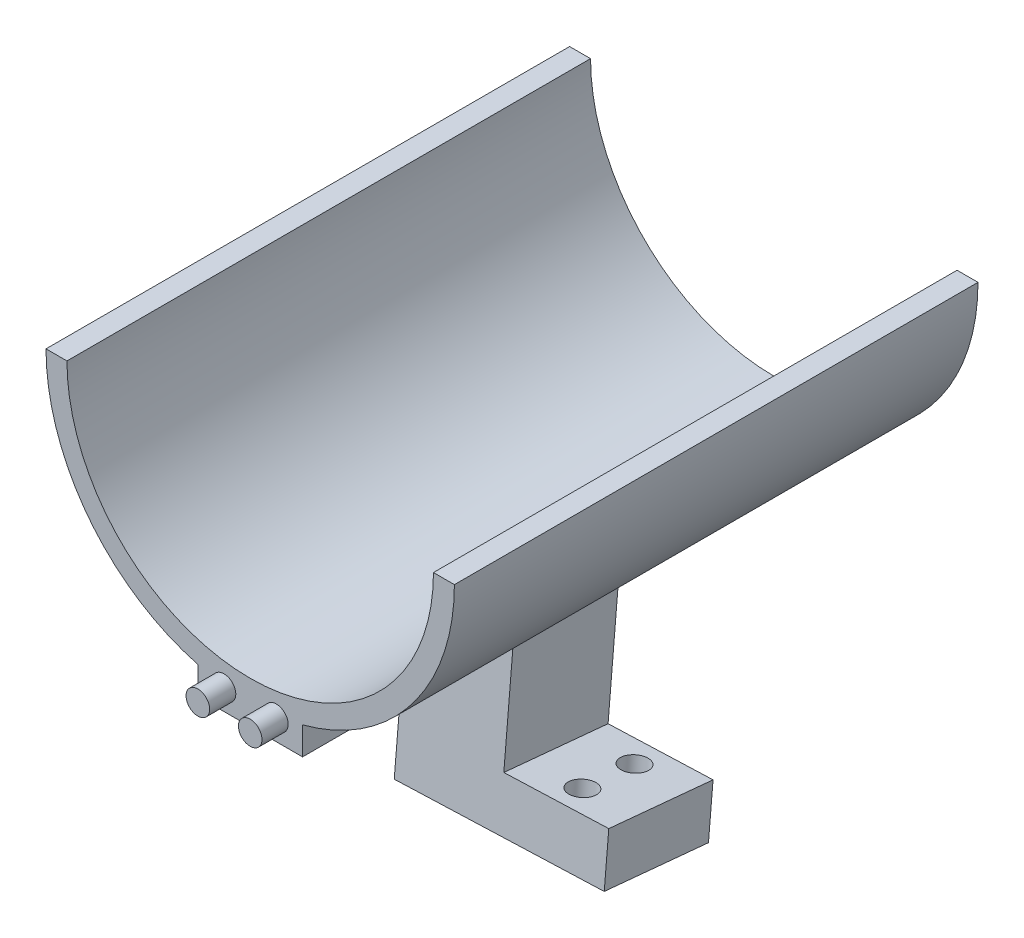
ISO-10303-21;
HEADER;
FILE_DESCRIPTION(('STEP AP214'),'2;1');
FILE_NAME('part.step','',(''),(''),'','','');
FILE_SCHEMA(('AUTOMOTIVE_DESIGN { 1 0 10303 214 1 1 1 1 }'));
ENDSEC;
DATA;
#1=APPLICATION_CONTEXT('core data for automotive mechanical design processes');
#2=APPLICATION_PROTOCOL_DEFINITION('international standard','automotive_design',2000,#1);
#3=PRODUCT_CONTEXT('',#1,'mechanical');
#4=PRODUCT('Part','Part','',(#3));
#5=PRODUCT_RELATED_PRODUCT_CATEGORY('part','',(#4));
#6=PRODUCT_DEFINITION_FORMATION('','',#4);
#7=PRODUCT_DEFINITION_CONTEXT('part definition',#1,'design');
#8=PRODUCT_DEFINITION('design','',#6,#7);
#9=PRODUCT_DEFINITION_SHAPE('','',#8);
#10=(LENGTH_UNIT() NAMED_UNIT(*) SI_UNIT(.MILLI.,.METRE.));
#11=(NAMED_UNIT(*) PLANE_ANGLE_UNIT() SI_UNIT($,.RADIAN.));
#12=(NAMED_UNIT(*) SI_UNIT($,.STERADIAN.) SOLID_ANGLE_UNIT());
#13=UNCERTAINTY_MEASURE_WITH_UNIT(LENGTH_MEASURE(1.E-05),#10,'distance_accuracy_value','');
#14=(GEOMETRIC_REPRESENTATION_CONTEXT(3) GLOBAL_UNCERTAINTY_ASSIGNED_CONTEXT((#13)) GLOBAL_UNIT_ASSIGNED_CONTEXT((#10,
#11,#12)) REPRESENTATION_CONTEXT('',''));
#15=CARTESIAN_POINT('',(0.,0.,0.));
#16=DIRECTION('',(0.,0.,1.));
#17=DIRECTION('',(1.,0.,0.));
#18=AXIS2_PLACEMENT_3D('',#15,#16,#17);
#19=CARTESIAN_POINT('',(9.99999999999999,3.11086419730137,35.544910429642));
#20=DIRECTION('',(-1.,0.,0.));
#21=DIRECTION('',(0.,0.,1.));
#22=AXIS2_PLACEMENT_3D('',#19,#20,#21);
#23=PLANE('',#22);
#24=DIRECTION('',(0.,0.094315540424242,0.995542354113818));
#25=VECTOR('',#24,1.);
#26=CARTESIAN_POINT('',(9.99999999999999,-66.6784039038325,41.6506802242622));
#27=LINE('',#26,#25);
#28=CARTESIAN_POINT('',(9.99999999999999,-66.6784039038328,41.6506802242622));
#29=VERTEX_POINT('',#28);
#30=CARTESIAN_POINT('',(10.,-64.7920443440303,61.5620418983127));
#31=VERTEX_POINT('',#30);
#32=EDGE_CURVE('E54',#29,#31,#27,.T.);
#33=ORIENTED_EDGE('',*,*,#32,.F.);
#34=DIRECTION('',(0.,-0.996194698091746,0.0871557427476515));
#35=VECTOR('',#34,1.);
#36=CARTESIAN_POINT('',(9.99999999999999,3.11086419730137,35.544910429642));
#37=LINE('',#36,#35);
#38=CARTESIAN_POINT('',(9.99999999999999,-37.6961536499415,39.1150618835755));
#39=VERTEX_POINT('',#38);
#40=EDGE_CURVE('E209',#39,#29,#37,.T.);
#41=ORIENTED_EDGE('',*,*,#40,.F.);
#42=DIRECTION('',(0.,0.,-1.));
#43=VECTOR('',#42,1.);
#44=CARTESIAN_POINT('',(10.,-37.6961536499415,100.));
#45=LINE('',#44,#43);
#46=CARTESIAN_POINT('',(10.,-37.6961536499415,59.1914586344425));
#47=VERTEX_POINT('',#46);
#48=EDGE_CURVE('E211',#47,#39,#45,.T.);
#49=ORIENTED_EDGE('',*,*,#48,.F.);
#50=DIRECTION('',(0.,-0.996194698091746,0.0871557427476515));
#51=VECTOR('',#50,1.);
#52=CARTESIAN_POINT('',(10.,4.8539790522544,55.4688043914769));
#53=LINE('',#52,#51);
#54=EDGE_CURVE('E59',#47,#31,#53,.T.);
#55=ORIENTED_EDGE('',*,*,#54,.T.);
#56=EDGE_LOOP('',(#33,#41,#49,#55));
#57=FACE_BOUND('',#56,.T.);
#58=ADVANCED_FACE('F39',(#57),#23,.F.);
#59=CARTESIAN_POINT('',(0.,0.,100.));
#60=DIRECTION('',(0.,0.,-1.));
#61=DIRECTION('',(-1.,0.,0.));
#62=AXIS2_PLACEMENT_3D('',#59,#60,#61);
#63=CYLINDRICAL_SURFACE('',#62,39.);
#64=DIRECTION('',(0.,0.,-1.));
#65=VECTOR('',#64,1.);
#66=CARTESIAN_POINT('',(10.,-37.6961536499415,100.));
#67=LINE('',#66,#65);
#68=CARTESIAN_POINT('',(10.,-37.6961536499415,0.));
#69=VERTEX_POINT('',#68);
#70=CARTESIAN_POINT('',(10.,-37.6961536499415,9.99999999999999));
#71=VERTEX_POINT('',#70);
#72=EDGE_CURVE('E256',#69,#71,#67,.F.);
#73=ORIENTED_EDGE('',*,*,#72,.F.);
#74=CARTESIAN_POINT('',(0.,0.,0.));
#75=DIRECTION('',(0.,0.,1.));
#76=DIRECTION('',(1.,0.,0.));
#77=AXIS2_PLACEMENT_3D('',#74,#75,#76);
#78=CIRCLE('',#77,39.);
#79=CARTESIAN_POINT('',(39.,0.,0.));
#80=VERTEX_POINT('',#79);
#81=EDGE_CURVE('E301',#69,#80,#78,.T.);
#82=ORIENTED_EDGE('',*,*,#81,.T.);
#83=DIRECTION('',(0.,0.,-1.));
#84=VECTOR('',#83,1.);
#85=CARTESIAN_POINT('',(39.,0.,100.));
#86=LINE('',#85,#84);
#87=CARTESIAN_POINT('',(39.,0.,100.));
#88=VERTEX_POINT('',#87);
#89=EDGE_CURVE('E11',#88,#80,#86,.T.);
#90=ORIENTED_EDGE('',*,*,#89,.F.);
#91=CARTESIAN_POINT('',(0.,0.,100.));
#92=DIRECTION('',(0.,0.,1.));
#93=DIRECTION('',(1.,0.,0.));
#94=AXIS2_PLACEMENT_3D('',#91,#92,#93);
#95=CIRCLE('',#94,39.);
#96=CARTESIAN_POINT('',(10.,-37.6961536499415,100.));
#97=VERTEX_POINT('',#96);
#98=EDGE_CURVE('E306',#97,#88,#95,.T.);
#99=ORIENTED_EDGE('',*,*,#98,.F.);
#100=DIRECTION('',(0.,0.,-1.));
#101=VECTOR('',#100,1.);
#102=CARTESIAN_POINT('',(10.,-37.6961536499415,100.));
#103=LINE('',#102,#101);
#104=CARTESIAN_POINT('',(10.,-37.6961536499415,90.));
#105=VERTEX_POINT('',#104);
#106=EDGE_CURVE('E293',#97,#105,#103,.T.);
#107=ORIENTED_EDGE('',*,*,#106,.T.);
#108=CARTESIAN_POINT('',(0.,0.,90.));
#109=DIRECTION('',(0.,0.,1.));
#110=DIRECTION('',(1.,0.,0.));
#111=AXIS2_PLACEMENT_3D('',#108,#109,#110);
#112=CIRCLE('',#111,39.);
#113=CARTESIAN_POINT('',(-10.,-37.6961536499415,90.));
#114=VERTEX_POINT('',#113);
#115=EDGE_CURVE('E299',#114,#105,#112,.T.);
#116=ORIENTED_EDGE('',*,*,#115,.F.);
#117=DIRECTION('',(0.,0.,-1.));
#118=VECTOR('',#117,1.);
#119=CARTESIAN_POINT('',(-10.,-37.6961536499415,100.));
#120=LINE('',#119,#118);
#121=CARTESIAN_POINT('',(-10.,-37.6961536499415,100.));
#122=VERTEX_POINT('',#121);
#123=EDGE_CURVE('E297',#122,#114,#120,.T.);
#124=ORIENTED_EDGE('',*,*,#123,.F.);
#125=CARTESIAN_POINT('',(-39.,0.,100.));
#126=VERTEX_POINT('',#125);
#127=EDGE_CURVE('E302',#126,#122,#95,.T.);
#128=ORIENTED_EDGE('',*,*,#127,.F.);
#129=DIRECTION('',(0.,0.,-1.));
#130=VECTOR('',#129,1.);
#131=CARTESIAN_POINT('',(-39.,0.,100.));
#132=LINE('',#131,#130);
#133=CARTESIAN_POINT('',(-39.,0.,0.));
#134=VERTEX_POINT('',#133);
#135=EDGE_CURVE('E314',#126,#134,#132,.T.);
#136=ORIENTED_EDGE('',*,*,#135,.T.);
#137=CARTESIAN_POINT('',(-10.,-37.6961536499415,0.));
#138=VERTEX_POINT('',#137);
#139=EDGE_CURVE('E315',#134,#138,#78,.T.);
#140=ORIENTED_EDGE('',*,*,#139,.T.);
#141=DIRECTION('',(0.,0.,-1.));
#142=VECTOR('',#141,1.);
#143=CARTESIAN_POINT('',(-10.,-37.6961536499415,100.));
#144=LINE('',#143,#142);
#145=CARTESIAN_POINT('',(-10.,-37.6961536499415,9.99999999999999));
#146=VERTEX_POINT('',#145);
#147=EDGE_CURVE('E253',#138,#146,#144,.F.);
#148=ORIENTED_EDGE('',*,*,#147,.T.);
#149=CARTESIAN_POINT('',(0.,0.,9.99999999999999));
#150=DIRECTION('',(0.,0.,-1.));
#151=DIRECTION('',(-1.,0.,0.));
#152=AXIS2_PLACEMENT_3D('',#149,#150,#151);
#153=CIRCLE('',#152,39.);
#154=EDGE_CURVE('E259',#71,#146,#153,.T.);
#155=ORIENTED_EDGE('',*,*,#154,.F.);
#156=EDGE_LOOP('',(#73,#82,#90,#99,#107,#116,#124,#128,#136,#140,#148,#155));
#157=FACE_BOUND('',#156,.T.);
#158=ORIENTED_EDGE('',*,*,#48,.T.);
#159=CARTESIAN_POINT('',(0.,0.,35.8170757806745));
#160=DIRECTION('',(0.,0.0871557427476515,0.996194698091746));
#161=DIRECTION('',(0.,0.996194698091746,-0.0871557427476515));
#162=AXIS2_PLACEMENT_3D('',#159,#160,#161);
#163=ELLIPSE('',#162,39.1489736641905,39.);
#164=CARTESIAN_POINT('',(-9.99999999999999,-37.6961536499415,39.1150618835756));
#165=VERTEX_POINT('',#164);
#166=EDGE_CURVE('E208',#39,#165,#163,.F.);
#167=ORIENTED_EDGE('',*,*,#166,.T.);
#168=DIRECTION('',(0.,0.,-1.));
#169=VECTOR('',#168,1.);
#170=CARTESIAN_POINT('',(-9.99999999999999,-37.6961536499415,100.));
#171=LINE('',#170,#169);
#172=CARTESIAN_POINT('',(-10.,-37.6961536499415,59.1914586344425));
#173=VERTEX_POINT('',#172);
#174=EDGE_CURVE('E206',#165,#173,#171,.F.);
#175=ORIENTED_EDGE('',*,*,#174,.T.);
#176=CARTESIAN_POINT('',(0.,0.,55.8934725315415));
#177=DIRECTION('',(0.,-0.0871557427476515,-0.996194698091746));
#178=DIRECTION('',(0.,0.996194698091746,-0.0871557427476515));
#179=AXIS2_PLACEMENT_3D('',#176,#177,#178);
#180=ELLIPSE('',#179,39.1489736641905,39.);
#181=EDGE_CURVE('E213',#173,#47,#180,.F.);
#182=ORIENTED_EDGE('',*,*,#181,.T.);
#183=EDGE_LOOP('',(#158,#167,#175,#182));
#184=FACE_BOUND('',#183,.T.);
#185=ADVANCED_FACE('F41',(#157,#184),#63,.T.);
#186=CARTESIAN_POINT('',(35.,0.,100.));
#187=DIRECTION('',(0.,1.,0.));
#188=DIRECTION('',(0.,0.,1.));
#189=AXIS2_PLACEMENT_3D('',#186,#187,#188);
#190=PLANE('',#189);
#191=DIRECTION('',(1.,0.,0.));
#192=VECTOR('',#191,1.);
#193=CARTESIAN_POINT('',(35.,0.,0.));
#194=LINE('',#193,#192);
#195=CARTESIAN_POINT('',(35.,0.,0.));
#196=VERTEX_POINT('',#195);
#197=EDGE_CURVE('E317',#196,#80,#194,.T.);
#198=ORIENTED_EDGE('',*,*,#197,.F.);
#199=DIRECTION('',(0.,0.,-1.));
#200=VECTOR('',#199,1.);
#201=CARTESIAN_POINT('',(35.,0.,100.));
#202=LINE('',#201,#200);
#203=CARTESIAN_POINT('',(35.,0.,100.));
#204=VERTEX_POINT('',#203);
#205=EDGE_CURVE('E47',#204,#196,#202,.T.);
#206=ORIENTED_EDGE('',*,*,#205,.F.);
#207=DIRECTION('',(1.,0.,0.));
#208=VECTOR('',#207,1.);
#209=CARTESIAN_POINT('',(35.,0.,100.));
#210=LINE('',#209,#208);
#211=EDGE_CURVE('E305',#204,#88,#210,.T.);
#212=ORIENTED_EDGE('',*,*,#211,.T.);
#213=ORIENTED_EDGE('',*,*,#89,.T.);
#214=EDGE_LOOP('',(#198,#206,#212,#213));
#215=FACE_BOUND('',#214,.T.);
#216=ADVANCED_FACE('F336',(#215),#190,.T.);
#217=CARTESIAN_POINT('',(0.,0.,100.));
#218=DIRECTION('',(0.,0.,-1.));
#219=DIRECTION('',(-1.,0.,0.));
#220=AXIS2_PLACEMENT_3D('',#217,#218,#219);
#221=CYLINDRICAL_SURFACE('',#220,35.);
#222=ORIENTED_EDGE('',*,*,#205,.T.);
#223=CARTESIAN_POINT('',(0.,0.,0.));
#224=DIRECTION('',(0.,0.,1.));
#225=DIRECTION('',(1.,0.,0.));
#226=AXIS2_PLACEMENT_3D('',#223,#224,#225);
#227=CIRCLE('',#226,35.);
#228=CARTESIAN_POINT('',(-35.,0.,0.));
#229=VERTEX_POINT('',#228);
#230=EDGE_CURVE('E320',#229,#196,#227,.T.);
#231=ORIENTED_EDGE('',*,*,#230,.F.);
#232=DIRECTION('',(0.,0.,-1.));
#233=VECTOR('',#232,1.);
#234=CARTESIAN_POINT('',(-35.,0.,100.));
#235=LINE('',#234,#233);
#236=CARTESIAN_POINT('',(-35.,0.,100.));
#237=VERTEX_POINT('',#236);
#238=EDGE_CURVE('E326',#237,#229,#235,.T.);
#239=ORIENTED_EDGE('',*,*,#238,.F.);
#240=CARTESIAN_POINT('',(0.,0.,100.));
#241=DIRECTION('',(0.,0.,1.));
#242=DIRECTION('',(1.,0.,0.));
#243=AXIS2_PLACEMENT_3D('',#240,#241,#242);
#244=CIRCLE('',#243,35.);
#245=EDGE_CURVE('E309',#237,#204,#244,.T.);
#246=ORIENTED_EDGE('',*,*,#245,.T.);
#247=EDGE_LOOP('',(#222,#231,#239,#246));
#248=FACE_BOUND('',#247,.T.);
#249=ADVANCED_FACE('F332',(#248),#221,.F.);
#250=CARTESIAN_POINT('',(-39.,0.,100.));
#251=DIRECTION('',(0.,1.,0.));
#252=DIRECTION('',(-1.,0.,0.));
#253=AXIS2_PLACEMENT_3D('',#250,#251,#252);
#254=PLANE('',#253);
#255=DIRECTION('',(1.,0.,0.));
#256=VECTOR('',#255,1.);
#257=CARTESIAN_POINT('',(-39.,0.,0.));
#258=LINE('',#257,#256);
#259=EDGE_CURVE('E322',#134,#229,#258,.T.);
#260=ORIENTED_EDGE('',*,*,#259,.F.);
#261=ORIENTED_EDGE('',*,*,#135,.F.);
#262=DIRECTION('',(1.,0.,0.));
#263=VECTOR('',#262,1.);
#264=CARTESIAN_POINT('',(-39.,0.,100.));
#265=LINE('',#264,#263);
#266=EDGE_CURVE('E311',#126,#237,#265,.T.);
#267=ORIENTED_EDGE('',*,*,#266,.T.);
#268=ORIENTED_EDGE('',*,*,#238,.T.);
#269=EDGE_LOOP('',(#260,#261,#267,#268));
#270=FACE_BOUND('',#269,.T.);
#271=ADVANCED_FACE('F345',(#270),#254,.T.);
#272=CARTESIAN_POINT('',(0.,0.,100.));
#273=DIRECTION('',(0.,0.,1.));
#274=DIRECTION('',(1.,0.,0.));
#275=AXIS2_PLACEMENT_3D('',#272,#273,#274);
#276=PLANE('',#275);
#277=CARTESIAN_POINT('',(5.,-39.,100.));
#278=DIRECTION('',(0.,0.,1.));
#279=DIRECTION('',(1.,0.,0.));
#280=AXIS2_PLACEMENT_3D('',#277,#278,#279);
#281=CIRCLE('',#280,2.25);
#282=CARTESIAN_POINT('',(7.25,-39.,100.));
#283=VERTEX_POINT('',#282);
#284=EDGE_CURVE('E262',#283,#283,#281,.T.);
#285=ORIENTED_EDGE('',*,*,#284,.F.);
#286=EDGE_LOOP('',(#285));
#287=FACE_BOUND('',#286,.T.);
#288=CARTESIAN_POINT('',(-5.,-39.,100.));
#289=DIRECTION('',(0.,0.,1.));
#290=DIRECTION('',(1.,0.,0.));
#291=AXIS2_PLACEMENT_3D('',#288,#289,#290);
#292=CIRCLE('',#291,2.25);
#293=CARTESIAN_POINT('',(-2.75,-39.,100.));
#294=VERTEX_POINT('',#293);
#295=EDGE_CURVE('E266',#294,#294,#292,.T.);
#296=ORIENTED_EDGE('',*,*,#295,.F.);
#297=EDGE_LOOP('',(#296));
#298=FACE_BOUND('',#297,.T.);
#299=ORIENTED_EDGE('',*,*,#127,.T.);
#300=DIRECTION('',(0.,1.,0.));
#301=VECTOR('',#300,1.);
#302=CARTESIAN_POINT('',(-10.,0.,100.));
#303=LINE('',#302,#301);
#304=CARTESIAN_POINT('',(-10.,-43.,100.));
#305=VERTEX_POINT('',#304);
#306=EDGE_CURVE('E279',#305,#122,#303,.T.);
#307=ORIENTED_EDGE('',*,*,#306,.F.);
#308=DIRECTION('',(1.,0.,0.));
#309=VECTOR('',#308,1.);
#310=CARTESIAN_POINT('',(0.,-43.,100.));
#311=LINE('',#310,#309);
#312=CARTESIAN_POINT('',(10.,-43.,100.));
#313=VERTEX_POINT('',#312);
#314=EDGE_CURVE('E272',#305,#313,#311,.T.);
#315=ORIENTED_EDGE('',*,*,#314,.T.);
#316=DIRECTION('',(0.,1.,0.));
#317=VECTOR('',#316,1.);
#318=CARTESIAN_POINT('',(10.,0.,100.));
#319=LINE('',#318,#317);
#320=EDGE_CURVE('E288',#313,#97,#319,.T.);
#321=ORIENTED_EDGE('',*,*,#320,.T.);
#322=ORIENTED_EDGE('',*,*,#98,.T.);
#323=ORIENTED_EDGE('',*,*,#211,.F.);
#324=ORIENTED_EDGE('',*,*,#245,.F.);
#325=ORIENTED_EDGE('',*,*,#266,.F.);
#326=EDGE_LOOP('',(#299,#307,#315,#321,#322,#323,#324,#325));
#327=FACE_BOUND('',#326,.T.);
#328=ADVANCED_FACE('F349',(#287,#298,#327),#276,.T.);
#329=CARTESIAN_POINT('',(0.,0.,0.));
#330=DIRECTION('',(0.,0.,1.));
#331=DIRECTION('',(1.,0.,0.));
#332=AXIS2_PLACEMENT_3D('',#329,#330,#331);
#333=PLANE('',#332);
#334=CARTESIAN_POINT('',(5.,-39.,0.));
#335=DIRECTION('',(0.,0.,-1.));
#336=DIRECTION('',(-1.,0.,0.));
#337=AXIS2_PLACEMENT_3D('',#334,#335,#336);
#338=CIRCLE('',#337,2.25);
#339=CARTESIAN_POINT('',(2.75,-39.,0.));
#340=VERTEX_POINT('',#339);
#341=EDGE_CURVE('E225',#340,#340,#338,.T.);
#342=ORIENTED_EDGE('',*,*,#341,.F.);
#343=EDGE_LOOP('',(#342));
#344=FACE_BOUND('',#343,.T.);
#345=CARTESIAN_POINT('',(-5.,-39.,0.));
#346=DIRECTION('',(0.,0.,-1.));
#347=DIRECTION('',(-1.,0.,0.));
#348=AXIS2_PLACEMENT_3D('',#345,#346,#347);
#349=CIRCLE('',#348,2.25);
#350=CARTESIAN_POINT('',(-7.25,-39.,0.));
#351=VERTEX_POINT('',#350);
#352=EDGE_CURVE('E220',#351,#351,#349,.T.);
#353=ORIENTED_EDGE('',*,*,#352,.F.);
#354=EDGE_LOOP('',(#353));
#355=FACE_BOUND('',#354,.T.);
#356=ORIENTED_EDGE('',*,*,#81,.F.);
#357=DIRECTION('',(0.,1.,0.));
#358=VECTOR('',#357,1.);
#359=CARTESIAN_POINT('',(10.,0.,0.));
#360=LINE('',#359,#358);
#361=CARTESIAN_POINT('',(10.,-43.,0.));
#362=VERTEX_POINT('',#361);
#363=EDGE_CURVE('E237',#362,#69,#360,.T.);
#364=ORIENTED_EDGE('',*,*,#363,.F.);
#365=DIRECTION('',(-1.,0.,0.));
#366=VECTOR('',#365,1.);
#367=CARTESIAN_POINT('',(0.,-43.,0.));
#368=LINE('',#367,#366);
#369=CARTESIAN_POINT('',(-10.,-43.,0.));
#370=VERTEX_POINT('',#369);
#371=EDGE_CURVE('E224',#362,#370,#368,.T.);
#372=ORIENTED_EDGE('',*,*,#371,.T.);
#373=DIRECTION('',(0.,1.,0.));
#374=VECTOR('',#373,1.);
#375=CARTESIAN_POINT('',(-10.,0.,0.));
#376=LINE('',#375,#374);
#377=EDGE_CURVE('E246',#370,#138,#376,.T.);
#378=ORIENTED_EDGE('',*,*,#377,.T.);
#379=ORIENTED_EDGE('',*,*,#139,.F.);
#380=ORIENTED_EDGE('',*,*,#259,.T.);
#381=ORIENTED_EDGE('',*,*,#230,.T.);
#382=ORIENTED_EDGE('',*,*,#197,.T.);
#383=EDGE_LOOP('',(#356,#364,#372,#378,#379,#380,#381,#382));
#384=FACE_BOUND('',#383,.T.);
#385=ADVANCED_FACE('F339',(#344,#355,#384),#333,.F.);
#386=CARTESIAN_POINT('',(-10.,0.,90.));
#387=DIRECTION('',(1.,0.,0.));
#388=DIRECTION('',(0.,0.,-1.));
#389=AXIS2_PLACEMENT_3D('',#386,#387,#388);
#390=PLANE('',#389);
#391=ORIENTED_EDGE('',*,*,#306,.T.);
#392=ORIENTED_EDGE('',*,*,#123,.T.);
#393=DIRECTION('',(0.,1.,0.));
#394=VECTOR('',#393,1.);
#395=CARTESIAN_POINT('',(-10.,0.,90.));
#396=LINE('',#395,#394);
#397=CARTESIAN_POINT('',(-10.,-43.,90.));
#398=VERTEX_POINT('',#397);
#399=EDGE_CURVE('E282',#398,#114,#396,.T.);
#400=ORIENTED_EDGE('',*,*,#399,.F.);
#401=DIRECTION('',(0.,0.,1.));
#402=VECTOR('',#401,1.);
#403=CARTESIAN_POINT('',(-10.,-43.,90.));
#404=LINE('',#403,#402);
#405=EDGE_CURVE('E291',#398,#305,#404,.T.);
#406=ORIENTED_EDGE('',*,*,#405,.T.);
#407=EDGE_LOOP('',(#391,#392,#400,#406));
#408=FACE_BOUND('',#407,.T.);
#409=ADVANCED_FACE('F407',(#408),#390,.F.);
#410=CARTESIAN_POINT('',(10.,0.,90.));
#411=DIRECTION('',(1.,0.,0.));
#412=DIRECTION('',(0.,0.,-1.));
#413=AXIS2_PLACEMENT_3D('',#410,#411,#412);
#414=PLANE('',#413);
#415=ORIENTED_EDGE('',*,*,#106,.F.);
#416=ORIENTED_EDGE('',*,*,#320,.F.);
#417=DIRECTION('',(0.,0.,1.));
#418=VECTOR('',#417,1.);
#419=CARTESIAN_POINT('',(10.,-43.,90.));
#420=LINE('',#419,#418);
#421=CARTESIAN_POINT('',(10.,-43.,90.));
#422=VERTEX_POINT('',#421);
#423=EDGE_CURVE('E285',#422,#313,#420,.T.);
#424=ORIENTED_EDGE('',*,*,#423,.F.);
#425=DIRECTION('',(0.,1.,0.));
#426=VECTOR('',#425,1.);
#427=CARTESIAN_POINT('',(10.,0.,90.));
#428=LINE('',#427,#426);
#429=EDGE_CURVE('E278',#422,#105,#428,.T.);
#430=ORIENTED_EDGE('',*,*,#429,.T.);
#431=EDGE_LOOP('',(#415,#416,#424,#430));
#432=FACE_BOUND('',#431,.T.);
#433=ADVANCED_FACE('F414',(#432),#414,.T.);
#434=CARTESIAN_POINT('',(0.,-43.,90.));
#435=DIRECTION('',(0.,-1.,0.));
#436=DIRECTION('',(0.,0.,-1.));
#437=AXIS2_PLACEMENT_3D('',#434,#435,#436);
#438=PLANE('',#437);
#439=ORIENTED_EDGE('',*,*,#314,.F.);
#440=ORIENTED_EDGE('',*,*,#405,.F.);
#441=DIRECTION('',(1.,0.,0.));
#442=VECTOR('',#441,1.);
#443=CARTESIAN_POINT('',(0.,-43.,90.));
#444=LINE('',#443,#442);
#445=EDGE_CURVE('E275',#398,#422,#444,.T.);
#446=ORIENTED_EDGE('',*,*,#445,.T.);
#447=ORIENTED_EDGE('',*,*,#423,.T.);
#448=EDGE_LOOP('',(#439,#440,#446,#447));
#449=FACE_BOUND('',#448,.T.);
#450=ADVANCED_FACE('F723',(#449),#438,.T.);
#451=CARTESIAN_POINT('',(0.,0.,90.));
#452=DIRECTION('',(0.,0.,1.));
#453=DIRECTION('',(1.,0.,0.));
#454=AXIS2_PLACEMENT_3D('',#451,#452,#453);
#455=PLANE('',#454);
#456=ORIENTED_EDGE('',*,*,#399,.T.);
#457=ORIENTED_EDGE('',*,*,#115,.T.);
#458=ORIENTED_EDGE('',*,*,#429,.F.);
#459=ORIENTED_EDGE('',*,*,#445,.F.);
#460=EDGE_LOOP('',(#456,#457,#458,#459));
#461=FACE_BOUND('',#460,.T.);
#462=ADVANCED_FACE('F453',(#461),#455,.F.);
#463=CARTESIAN_POINT('',(-5.,-39.,105.));
#464=DIRECTION('',(0.,0.,-1.));
#465=DIRECTION('',(-1.,0.,0.));
#466=AXIS2_PLACEMENT_3D('',#463,#464,#465);
#467=CYLINDRICAL_SURFACE('',#466,2.25);
#468=CARTESIAN_POINT('',(-5.,-39.,105.));
#469=DIRECTION('',(0.,0.,1.));
#470=DIRECTION('',(1.,0.,0.));
#471=AXIS2_PLACEMENT_3D('',#468,#469,#470);
#472=CIRCLE('',#471,2.25);
#473=CARTESIAN_POINT('',(-2.75,-39.,105.));
#474=VERTEX_POINT('',#473);
#475=EDGE_CURVE('E269',#474,#474,#472,.T.);
#476=ORIENTED_EDGE('',*,*,#475,.F.);
#477=EDGE_LOOP('',(#476));
#478=FACE_BOUND('',#477,.T.);
#479=ORIENTED_EDGE('',*,*,#295,.T.);
#480=EDGE_LOOP('',(#479));
#481=FACE_BOUND('',#480,.T.);
#482=ADVANCED_FACE('F458',(#478,#481),#467,.T.);
#483=CARTESIAN_POINT('',(0.,0.,105.));
#484=DIRECTION('',(0.,0.,1.));
#485=DIRECTION('',(1.,0.,0.));
#486=AXIS2_PLACEMENT_3D('',#483,#484,#485);
#487=PLANE('',#486);
#488=ORIENTED_EDGE('',*,*,#475,.T.);
#489=EDGE_LOOP('',(#488));
#490=FACE_BOUND('',#489,.T.);
#491=ADVANCED_FACE('F463',(#490),#487,.T.);
#492=CARTESIAN_POINT('',(5.,-39.,105.));
#493=DIRECTION('',(0.,0.,-1.));
#494=DIRECTION('',(-1.,0.,0.));
#495=AXIS2_PLACEMENT_3D('',#492,#493,#494);
#496=CYLINDRICAL_SURFACE('',#495,2.25);
#497=CARTESIAN_POINT('',(5.,-39.,105.));
#498=DIRECTION('',(0.,0.,1.));
#499=DIRECTION('',(1.,0.,0.));
#500=AXIS2_PLACEMENT_3D('',#497,#498,#499);
#501=CIRCLE('',#500,2.25);
#502=CARTESIAN_POINT('',(7.25,-39.,105.));
#503=VERTEX_POINT('',#502);
#504=EDGE_CURVE('E263',#503,#503,#501,.T.);
#505=ORIENTED_EDGE('',*,*,#504,.F.);
#506=EDGE_LOOP('',(#505));
#507=FACE_BOUND('',#506,.T.);
#508=ORIENTED_EDGE('',*,*,#284,.T.);
#509=EDGE_LOOP('',(#508));
#510=FACE_BOUND('',#509,.T.);
#511=ADVANCED_FACE('F474',(#507,#510),#496,.T.);
#512=CARTESIAN_POINT('',(0.,0.,105.));
#513=DIRECTION('',(0.,0.,1.));
#514=DIRECTION('',(1.,0.,0.));
#515=AXIS2_PLACEMENT_3D('',#512,#513,#514);
#516=PLANE('',#515);
#517=ORIENTED_EDGE('',*,*,#504,.T.);
#518=EDGE_LOOP('',(#517));
#519=FACE_BOUND('',#518,.T.);
#520=ADVANCED_FACE('F484',(#519),#516,.T.);
#521=CARTESIAN_POINT('',(10.,0.,10.));
#522=DIRECTION('',(-1.,0.,0.));
#523=DIRECTION('',(0.,0.,1.));
#524=AXIS2_PLACEMENT_3D('',#521,#522,#523);
#525=PLANE('',#524);
#526=ORIENTED_EDGE('',*,*,#363,.T.);
#527=ORIENTED_EDGE('',*,*,#72,.T.);
#528=DIRECTION('',(0.,1.,0.));
#529=VECTOR('',#528,1.);
#530=CARTESIAN_POINT('',(10.,0.,10.));
#531=LINE('',#530,#529);
#532=CARTESIAN_POINT('',(10.,-43.,10.));
#533=VERTEX_POINT('',#532);
#534=EDGE_CURVE('E240',#533,#71,#531,.T.);
#535=ORIENTED_EDGE('',*,*,#534,.F.);
#536=DIRECTION('',(0.,0.,-1.));
#537=VECTOR('',#536,1.);
#538=CARTESIAN_POINT('',(10.,-43.,10.));
#539=LINE('',#538,#537);
#540=EDGE_CURVE('E251',#533,#362,#539,.T.);
#541=ORIENTED_EDGE('',*,*,#540,.T.);
#542=EDGE_LOOP('',(#526,#527,#535,#541));
#543=FACE_BOUND('',#542,.T.);
#544=ADVANCED_FACE('F357',(#543),#525,.F.);
#545=CARTESIAN_POINT('',(-10.,0.,10.));
#546=DIRECTION('',(-1.,0.,0.));
#547=DIRECTION('',(0.,0.,1.));
#548=AXIS2_PLACEMENT_3D('',#545,#546,#547);
#549=PLANE('',#548);
#550=ORIENTED_EDGE('',*,*,#147,.F.);
#551=ORIENTED_EDGE('',*,*,#377,.F.);
#552=DIRECTION('',(0.,0.,-1.));
#553=VECTOR('',#552,1.);
#554=CARTESIAN_POINT('',(-10.,-43.,10.));
#555=LINE('',#554,#553);
#556=CARTESIAN_POINT('',(-10.,-43.,10.));
#557=VERTEX_POINT('',#556);
#558=EDGE_CURVE('E243',#557,#370,#555,.T.);
#559=ORIENTED_EDGE('',*,*,#558,.F.);
#560=DIRECTION('',(0.,1.,0.));
#561=VECTOR('',#560,1.);
#562=CARTESIAN_POINT('',(-10.,0.,10.));
#563=LINE('',#562,#561);
#564=EDGE_CURVE('E236',#557,#146,#563,.T.);
#565=ORIENTED_EDGE('',*,*,#564,.T.);
#566=EDGE_LOOP('',(#550,#551,#559,#565));
#567=FACE_BOUND('',#566,.T.);
#568=ADVANCED_FACE('F366',(#567),#549,.T.);
#569=CARTESIAN_POINT('',(0.,-43.,10.));
#570=DIRECTION('',(0.,-1.,0.));
#571=DIRECTION('',(0.,0.,-1.));
#572=AXIS2_PLACEMENT_3D('',#569,#570,#571);
#573=PLANE('',#572);
#574=ORIENTED_EDGE('',*,*,#371,.F.);
#575=ORIENTED_EDGE('',*,*,#540,.F.);
#576=DIRECTION('',(-1.,0.,0.));
#577=VECTOR('',#576,1.);
#578=CARTESIAN_POINT('',(0.,-43.,10.));
#579=LINE('',#578,#577);
#580=EDGE_CURVE('E233',#533,#557,#579,.T.);
#581=ORIENTED_EDGE('',*,*,#580,.T.);
#582=ORIENTED_EDGE('',*,*,#558,.T.);
#583=EDGE_LOOP('',(#574,#575,#581,#582));
#584=FACE_BOUND('',#583,.T.);
#585=ADVANCED_FACE('F360',(#584),#573,.T.);
#586=CARTESIAN_POINT('',(0.,0.,10.));
#587=DIRECTION('',(0.,0.,-1.));
#588=DIRECTION('',(-1.,0.,0.));
#589=AXIS2_PLACEMENT_3D('',#586,#587,#588);
#590=PLANE('',#589);
#591=ORIENTED_EDGE('',*,*,#534,.T.);
#592=ORIENTED_EDGE('',*,*,#154,.T.);
#593=ORIENTED_EDGE('',*,*,#564,.F.);
#594=ORIENTED_EDGE('',*,*,#580,.F.);
#595=EDGE_LOOP('',(#591,#592,#593,#594));
#596=FACE_BOUND('',#595,.T.);
#597=ADVANCED_FACE('F368',(#596),#590,.F.);
#598=CARTESIAN_POINT('',(-5.,-39.,6.));
#599=DIRECTION('',(0.,0.,-1.));
#600=DIRECTION('',(-1.,0.,0.));
#601=AXIS2_PLACEMENT_3D('',#598,#599,#600);
#602=CYLINDRICAL_SURFACE('',#601,2.25);
#603=CARTESIAN_POINT('',(-5.,-39.,6.));
#604=DIRECTION('',(0.,0.,-1.));
#605=DIRECTION('',(-1.,0.,0.));
#606=AXIS2_PLACEMENT_3D('',#603,#604,#605);
#607=CIRCLE('',#606,2.25);
#608=CARTESIAN_POINT('',(-7.25,-39.,6.));
#609=VERTEX_POINT('',#608);
#610=EDGE_CURVE('E228',#609,#609,#607,.T.);
#611=ORIENTED_EDGE('',*,*,#610,.F.);
#612=EDGE_LOOP('',(#611));
#613=FACE_BOUND('',#612,.T.);
#614=ORIENTED_EDGE('',*,*,#352,.T.);
#615=EDGE_LOOP('',(#614));
#616=FACE_BOUND('',#615,.T.);
#617=ADVANCED_FACE('F370',(#613,#616),#602,.F.);
#618=CARTESIAN_POINT('',(0.,0.,6.));
#619=DIRECTION('',(0.,0.,-1.));
#620=DIRECTION('',(-1.,0.,0.));
#621=AXIS2_PLACEMENT_3D('',#618,#619,#620);
#622=PLANE('',#621);
#623=ORIENTED_EDGE('',*,*,#610,.T.);
#624=EDGE_LOOP('',(#623));
#625=FACE_BOUND('',#624,.T.);
#626=ADVANCED_FACE('F376',(#625),#622,.T.);
#627=CARTESIAN_POINT('',(5.,-39.,6.));
#628=DIRECTION('',(0.,0.,-1.));
#629=DIRECTION('',(-1.,0.,0.));
#630=AXIS2_PLACEMENT_3D('',#627,#628,#629);
#631=CYLINDRICAL_SURFACE('',#630,2.25);
#632=CARTESIAN_POINT('',(5.,-39.,6.));
#633=DIRECTION('',(0.,0.,-1.));
#634=DIRECTION('',(-1.,0.,0.));
#635=AXIS2_PLACEMENT_3D('',#632,#633,#634);
#636=CIRCLE('',#635,2.25);
#637=CARTESIAN_POINT('',(2.75,-39.,6.));
#638=VERTEX_POINT('',#637);
#639=EDGE_CURVE('E221',#638,#638,#636,.T.);
#640=ORIENTED_EDGE('',*,*,#639,.F.);
#641=EDGE_LOOP('',(#640));
#642=FACE_BOUND('',#641,.T.);
#643=ORIENTED_EDGE('',*,*,#341,.T.);
#644=EDGE_LOOP('',(#643));
#645=FACE_BOUND('',#644,.T.);
#646=ADVANCED_FACE('F393',(#642,#645),#631,.F.);
#647=CARTESIAN_POINT('',(0.,0.,6.));
#648=DIRECTION('',(0.,0.,-1.));
#649=DIRECTION('',(-1.,0.,0.));
#650=AXIS2_PLACEMENT_3D('',#647,#648,#649);
#651=PLANE('',#650);
#652=ORIENTED_EDGE('',*,*,#639,.T.);
#653=EDGE_LOOP('',(#652));
#654=FACE_BOUND('',#653,.T.);
#655=ADVANCED_FACE('F390',(#654),#651,.T.);
#656=CARTESIAN_POINT('',(-10.,3.11086419730137,35.544910429642));
#657=DIRECTION('',(0.,0.0871557427476515,0.996194698091746));
#658=DIRECTION('',(0.,-0.996194698091746,0.0871557427476515));
#659=AXIS2_PLACEMENT_3D('',#656,#657,#658);
#660=PLANE('',#659);
#661=ORIENTED_EDGE('',*,*,#166,.F.);
#662=ORIENTED_EDGE('',*,*,#40,.T.);
#663=DIRECTION('',(-0.999411883181242,-0.034160731366775,0.00298867673238904));
#664=VECTOR('',#663,1.);
#665=CARTESIAN_POINT('',(29.9882376636248,-65.995189276497,41.5909066896144));
#666=LINE('',#665,#664);
#667=CARTESIAN_POINT('',(29.9882376636248,-65.995189276497,41.5909066896144));
#668=VERTEX_POINT('',#667);
#669=EDGE_CURVE('E201',#668,#29,#666,.T.);
#670=ORIENTED_EDGE('',*,*,#669,.F.);
#671=DIRECTION('',(0.,0.996194698091746,-0.0871557427476493));
#672=VECTOR('',#671,1.);
#673=CARTESIAN_POINT('',(29.9882376636248,-75.9571362574145,42.4624641170909));
#674=LINE('',#673,#672);
#675=CARTESIAN_POINT('',(29.9882376636248,-75.9571362574145,42.4624641170909));
#676=VERTEX_POINT('',#675);
#677=EDGE_CURVE('E185',#676,#668,#674,.T.);
#678=ORIENTED_EDGE('',*,*,#677,.F.);
#679=DIRECTION('',(-0.999411883181242,-0.034160731366779,0.00298867673234737));
#680=VECTOR('',#679,1.);
#681=CARTESIAN_POINT('',(-10.9554066463384,-77.3566241542338,42.5849034428051));
#682=LINE('',#681,#680);
#683=CARTESIAN_POINT('',(-10.,-77.323967558549,42.5820463608934));
#684=VERTEX_POINT('',#683);
#685=EDGE_CURVE('E182',#676,#684,#682,.T.);
#686=ORIENTED_EDGE('',*,*,#685,.T.);
#687=DIRECTION('',(0.,-0.996194698091746,0.0871557427476515));
#688=VECTOR('',#687,1.);
#689=CARTESIAN_POINT('',(-10.,3.11086419730137,35.544910429642));
#690=LINE('',#689,#688);
#691=EDGE_CURVE('E216',#165,#684,#690,.T.);
#692=ORIENTED_EDGE('',*,*,#691,.F.);
#693=EDGE_LOOP('',(#661,#662,#670,#678,#686,#692));
#694=FACE_BOUND('',#693,.T.);
#695=ADVANCED_FACE('F388',(#694),#660,.F.);
#696=CARTESIAN_POINT('',(-10.,3.11086419730137,35.544910429642));
#697=DIRECTION('',(1.,0.,0.));
#698=DIRECTION('',(0.,0.,-1.));
#699=AXIS2_PLACEMENT_3D('',#696,#697,#698);
#700=PLANE('',#699);
#701=ORIENTED_EDGE('',*,*,#174,.F.);
#702=ORIENTED_EDGE('',*,*,#691,.T.);
#703=DIRECTION('',(0.,0.0943155404242425,0.995542354113818));
#704=VECTOR('',#703,1.);
#705=CARTESIAN_POINT('',(-10.,-77.3428708401357,42.3825138409432));
#706=LINE('',#705,#704);
#707=CARTESIAN_POINT('',(-10.,-75.4376079987468,62.4934080349439));
#708=VERTEX_POINT('',#707);
#709=EDGE_CURVE('E176',#684,#708,#706,.T.);
#710=ORIENTED_EDGE('',*,*,#709,.T.);
#711=DIRECTION('',(0.,-0.996194698091746,0.0871557427476515));
#712=VECTOR('',#711,1.);
#713=CARTESIAN_POINT('',(-10.,4.8539790522544,55.4688043914769));
#714=LINE('',#713,#712);
#715=EDGE_CURVE('E172',#173,#708,#714,.T.);
#716=ORIENTED_EDGE('',*,*,#715,.F.);
#717=EDGE_LOOP('',(#701,#702,#710,#716));
#718=FACE_BOUND('',#717,.T.);
#719=ADVANCED_FACE('F562',(#718),#700,.F.);
#720=CARTESIAN_POINT('',(-10.,4.8539790522544,55.4688043914769));
#721=DIRECTION('',(0.,-0.0871557427476515,-0.996194698091746));
#722=DIRECTION('',(0.,0.996194698091746,-0.0871557427476515));
#723=AXIS2_PLACEMENT_3D('',#720,#721,#722);
#724=PLANE('',#723);
#725=ORIENTED_EDGE('',*,*,#181,.F.);
#726=ORIENTED_EDGE('',*,*,#715,.T.);
#727=DIRECTION('',(0.999411883181242,0.034160731366779,-0.00298867673234737));
#728=VECTOR('',#727,1.);
#729=CARTESIAN_POINT('',(-10.9603345452916,-75.4704330341261,62.4962798534194));
#730=LINE('',#729,#728);
#731=CARTESIAN_POINT('',(29.9882376636248,-74.0707766976123,62.3738257911414));
#732=VERTEX_POINT('',#731);
#733=EDGE_CURVE('E164',#708,#732,#730,.T.);
#734=ORIENTED_EDGE('',*,*,#733,.T.);
#735=DIRECTION('',(0.,-0.996194698091746,0.0871557427476508));
#736=VECTOR('',#735,1.);
#737=CARTESIAN_POINT('',(29.9882376636248,-64.1088297166948,61.5022683636649));
#738=LINE('',#737,#736);
#739=CARTESIAN_POINT('',(29.9882376636248,-64.1088297166948,61.5022683636649));
#740=VERTEX_POINT('',#739);
#741=EDGE_CURVE('E170',#740,#732,#738,.T.);
#742=ORIENTED_EDGE('',*,*,#741,.F.);
#743=DIRECTION('',(-0.999411883181242,-0.034160731366775,0.00298867673238904));
#744=VECTOR('',#743,1.);
#745=CARTESIAN_POINT('',(29.9882376636248,-64.1088297166948,61.5022683636649));
#746=LINE('',#745,#744);
#747=EDGE_CURVE('E198',#740,#31,#746,.T.);
#748=ORIENTED_EDGE('',*,*,#747,.T.);
#749=ORIENTED_EDGE('',*,*,#54,.F.);
#750=EDGE_LOOP('',(#725,#726,#734,#742,#748,#749));
#751=FACE_BOUND('',#750,.T.);
#752=ADVANCED_FACE('F167',(#751),#724,.F.);
#753=CARTESIAN_POINT('',(-146.701822507472,-74.8761866505049,118.149435157921));
#754=DIRECTION('',(0.0342903346263603,-0.994956889147722,0.0942600747331559));
#755=DIRECTION('',(-0.0336572461819074,-0.0954116912366169,-0.994868734534772));
#756=AXIS2_PLACEMENT_3D('',#753,#754,#755);
#757=PLANE('',#756);
#758=CARTESIAN_POINT('',(20.3368113607239,-74.8654754553425,57.4964652802972));
#759=DIRECTION('',(0.0342903346263603,-0.994956889147722,0.0942600747331559));
#760=DIRECTION('',(0.,-0.0943155404242425,-0.995542354113818));
#761=AXIS2_PLACEMENT_3D('',#758,#759,#760);
#762=CIRCLE('',#761,2.5);
#763=CARTESIAN_POINT('',(20.3368113607239,-75.1012643064031,55.0076093950127));
#764=VERTEX_POINT('',#763);
#765=EDGE_CURVE('E192',#764,#764,#762,.T.);
#766=ORIENTED_EDGE('',*,*,#765,.F.);
#767=EDGE_LOOP('',(#766));
#768=FACE_BOUND('',#767,.T.);
#769=CARTESIAN_POINT('',(20.3368113607238,-75.8086795822404,47.5405274499243));
#770=DIRECTION('',(0.0342903346263603,-0.994956889147722,0.0942600747331559));
#771=DIRECTION('',(0.,-0.0943155404242425,-0.995542354113818));
#772=AXIS2_PLACEMENT_3D('',#769,#770,#771);
#773=CIRCLE('',#772,2.5);
#774=CARTESIAN_POINT('',(20.3368113607238,-76.044468433301,45.0516715646398));
#775=VERTEX_POINT('',#774);
#776=EDGE_CURVE('E655',#775,#775,#773,.T.);
#777=ORIENTED_EDGE('',*,*,#776,.F.);
#778=EDGE_LOOP('',(#777));
#779=FACE_BOUND('',#778,.T.);
#780=ORIENTED_EDGE('',*,*,#733,.F.);
#781=ORIENTED_EDGE('',*,*,#709,.F.);
#782=ORIENTED_EDGE('',*,*,#685,.F.);
#783=DIRECTION('',(0.,-0.0943155404242426,-0.995542354113818));
#784=VECTOR('',#783,1.);
#785=CARTESIAN_POINT('',(29.9882376636248,-74.0707766976123,62.3738257911414));
#786=LINE('',#785,#784);
#787=EDGE_CURVE('E179',#732,#676,#786,.T.);
#788=ORIENTED_EDGE('',*,*,#787,.F.);
#789=EDGE_LOOP('',(#780,#781,#782,#788));
#790=FACE_BOUND('',#789,.T.);
#791=ADVANCED_FACE('F180',(#768,#779,#790),#757,.T.);
#792=CARTESIAN_POINT('',(29.9882376636248,-65.995189276497,41.5909066896144));
#793=DIRECTION('',(0.0342903346263603,-0.994956889147722,0.0942600747331555));
#794=DIRECTION('',(0.,-0.094315540424242,-0.995542354113818));
#795=AXIS2_PLACEMENT_3D('',#792,#793,#794);
#796=PLANE('',#795);
#797=CARTESIAN_POINT('',(19.9941185280971,-64.922014757196,56.5544432100582));
#798=DIRECTION('',(-0.0342903346263603,0.994956889147722,-0.0942600747331561));
#799=DIRECTION('',(0.,0.0943155404242426,0.995542354113818));
#800=AXIS2_PLACEMENT_3D('',#797,#798,#799);
#801=CIRCLE('',#800,2.5);
#802=CARTESIAN_POINT('',(19.9941185280971,-64.6862259061354,59.0432990953428));
#803=VERTEX_POINT('',#802);
#804=EDGE_CURVE('E654',#803,#803,#801,.T.);
#805=ORIENTED_EDGE('',*,*,#804,.F.);
#806=EDGE_LOOP('',(#805));
#807=FACE_BOUND('',#806,.T.);
#808=CARTESIAN_POINT('',(19.9941185280971,-65.8652188840939,46.5985053796853));
#809=DIRECTION('',(-0.0342903346263603,0.994956889147722,-0.0942600747331561));
#810=DIRECTION('',(0.,0.0943155404242426,0.995542354113818));
#811=AXIS2_PLACEMENT_3D('',#808,#809,#810);
#812=CIRCLE('',#811,2.5);
#813=CARTESIAN_POINT('',(19.9941185280971,-65.6294300330333,49.0873612649699));
#814=VERTEX_POINT('',#813);
#815=EDGE_CURVE('E656',#814,#814,#812,.T.);
#816=ORIENTED_EDGE('',*,*,#815,.F.);
#817=EDGE_LOOP('',(#816));
#818=FACE_BOUND('',#817,.T.);
#819=ORIENTED_EDGE('',*,*,#32,.T.);
#820=ORIENTED_EDGE('',*,*,#747,.F.);
#821=DIRECTION('',(0.,0.094315540424242,0.995542354113818));
#822=VECTOR('',#821,1.);
#823=CARTESIAN_POINT('',(29.9882376636248,-65.995189276497,41.5909066896144));
#824=LINE('',#823,#822);
#825=EDGE_CURVE('E189',#668,#740,#824,.T.);
#826=ORIENTED_EDGE('',*,*,#825,.F.);
#827=ORIENTED_EDGE('',*,*,#669,.T.);
#828=EDGE_LOOP('',(#819,#820,#826,#827));
#829=FACE_BOUND('',#828,.T.);
#830=ADVANCED_FACE('F602',(#807,#818,#829),#796,.F.);
#831=CARTESIAN_POINT('',(29.9882376636248,0.6832146273355,-0.0597735346477826));
#832=DIRECTION('',(1.,0.,0.));
#833=DIRECTION('',(0.,0.,-1.));
#834=AXIS2_PLACEMENT_3D('',#831,#832,#833);
#835=PLANE('',#834);
#836=ORIENTED_EDGE('',*,*,#741,.T.);
#837=ORIENTED_EDGE('',*,*,#787,.T.);
#838=ORIENTED_EDGE('',*,*,#677,.T.);
#839=ORIENTED_EDGE('',*,*,#825,.T.);
#840=EDGE_LOOP('',(#836,#837,#838,#839));
#841=FACE_BOUND('',#840,.T.);
#842=ADVANCED_FACE('F187',(#841),#835,.T.);
#843=CARTESIAN_POINT('',(20.6799252206243,-85.7643566670483,48.4837068743484));
#844=DIRECTION('',(-0.0342903346263603,0.994956889147722,-0.0942600747331559));
#845=DIRECTION('',(0.,0.0943155404242425,0.995542354113818));
#846=AXIS2_PLACEMENT_3D('',#843,#844,#845);
#847=CYLINDRICAL_SURFACE('',#846,2.5);
#848=ORIENTED_EDGE('',*,*,#776,.T.);
#849=EDGE_LOOP('',(#848));
#850=FACE_BOUND('',#849,.T.);
#851=ORIENTED_EDGE('',*,*,#815,.T.);
#852=EDGE_LOOP('',(#851));
#853=FACE_BOUND('',#852,.T.);
#854=ADVANCED_FACE('F601',(#850,#853),#847,.F.);
#855=CARTESIAN_POINT('',(20.6799252206243,-84.8211525401504,58.4396447047214));
#856=DIRECTION('',(-0.0342903346263603,0.994956889147722,-0.0942600747331559));
#857=DIRECTION('',(0.,0.0943155404242425,0.995542354113818));
#858=AXIS2_PLACEMENT_3D('',#855,#856,#857);
#859=CYLINDRICAL_SURFACE('',#858,2.5);
#860=ORIENTED_EDGE('',*,*,#765,.T.);
#861=EDGE_LOOP('',(#860));
#862=FACE_BOUND('',#861,.T.);
#863=ORIENTED_EDGE('',*,*,#804,.T.);
#864=EDGE_LOOP('',(#863));
#865=FACE_BOUND('',#864,.T.);
#866=ADVANCED_FACE('F629',(#862,#865),#859,.F.);
#867=CLOSED_SHELL('',(#58,#185,#216,#249,#271,#328,#385,#409,#433,#450,#462,#482,#491,#511,#520,
#544,#568,#585,#597,#617,#626,#646,#655,#695,#719,#752,#791,#830,#842,#854,#866));
#868=MANIFOLD_SOLID_BREP('B2',#867);
#869=ADVANCED_BREP_SHAPE_REPRESENTATION('',(#18,#868),#14);
#870=SHAPE_DEFINITION_REPRESENTATION(#9,#869);
ENDSEC;
END-ISO-10303-21;
